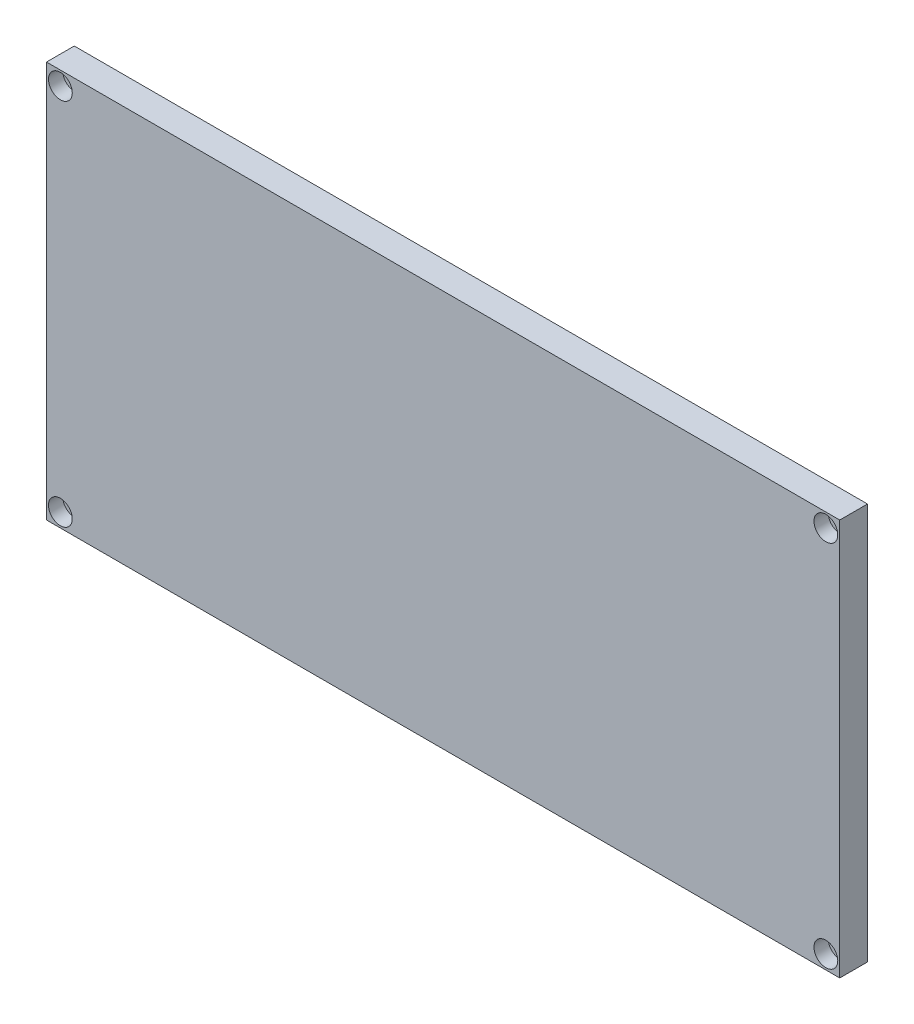
ISO-10303-21;
HEADER;
FILE_DESCRIPTION(('STEP AP214'),'2;1');
FILE_NAME('part.step','',(''),(''),'','','');
FILE_SCHEMA(('AUTOMOTIVE_DESIGN { 1 0 10303 214 1 1 1 1 }'));
ENDSEC;
DATA;
#1=APPLICATION_CONTEXT('core data for automotive mechanical design processes');
#2=APPLICATION_PROTOCOL_DEFINITION('international standard','automotive_design',2000,#1);
#3=PRODUCT_CONTEXT('',#1,'mechanical');
#4=PRODUCT('Part','Part','',(#3));
#5=PRODUCT_RELATED_PRODUCT_CATEGORY('part','',(#4));
#6=PRODUCT_DEFINITION_FORMATION('','',#4);
#7=PRODUCT_DEFINITION_CONTEXT('part definition',#1,'design');
#8=PRODUCT_DEFINITION('design','',#6,#7);
#9=PRODUCT_DEFINITION_SHAPE('','',#8);
#10=(LENGTH_UNIT() NAMED_UNIT(*) SI_UNIT(.MILLI.,.METRE.));
#11=(NAMED_UNIT(*) PLANE_ANGLE_UNIT() SI_UNIT($,.RADIAN.));
#12=(NAMED_UNIT(*) SI_UNIT($,.STERADIAN.) SOLID_ANGLE_UNIT());
#13=UNCERTAINTY_MEASURE_WITH_UNIT(LENGTH_MEASURE(1.E-05),#10,'distance_accuracy_value','');
#14=(GEOMETRIC_REPRESENTATION_CONTEXT(3) GLOBAL_UNCERTAINTY_ASSIGNED_CONTEXT((#13)) GLOBAL_UNIT_ASSIGNED_CONTEXT((#10,
#11,#12)) REPRESENTATION_CONTEXT('',''));
#15=CARTESIAN_POINT('',(0.,0.,0.));
#16=DIRECTION('',(0.,0.,1.));
#17=DIRECTION('',(1.,0.,0.));
#18=AXIS2_PLACEMENT_3D('',#15,#16,#17);
#19=CARTESIAN_POINT('',(-25.4,12.7,-1.778));
#20=DIRECTION('',(-1.,0.,0.));
#21=DIRECTION('',(0.,-1.,0.));
#22=AXIS2_PLACEMENT_3D('',#19,#20,#21);
#23=PLANE('',#22);
#24=DIRECTION('',(0.,-1.,0.));
#25=VECTOR('',#24,1.);
#26=CARTESIAN_POINT('',(-25.4,12.7,0.));
#27=LINE('',#26,#25);
#28=CARTESIAN_POINT('',(-25.4,12.7,0.));
#29=VERTEX_POINT('',#28);
#30=CARTESIAN_POINT('',(-25.4,-12.7,0.));
#31=VERTEX_POINT('',#30);
#32=EDGE_CURVE('E116',#29,#31,#27,.T.);
#33=ORIENTED_EDGE('',*,*,#32,.F.);
#34=DIRECTION('',(0.,0.,1.));
#35=VECTOR('',#34,1.);
#36=CARTESIAN_POINT('',(-25.4,12.7,-1.778));
#37=LINE('',#36,#35);
#38=CARTESIAN_POINT('',(-25.4,12.7,-1.778));
#39=VERTEX_POINT('',#38);
#40=EDGE_CURVE('E11',#39,#29,#37,.T.);
#41=ORIENTED_EDGE('',*,*,#40,.F.);
#42=DIRECTION('',(0.,-1.,0.));
#43=VECTOR('',#42,1.);
#44=CARTESIAN_POINT('',(-25.4,12.7,-1.778));
#45=LINE('',#44,#43);
#46=CARTESIAN_POINT('',(-25.4,-12.7,-1.778));
#47=VERTEX_POINT('',#46);
#48=EDGE_CURVE('E107',#39,#47,#45,.T.);
#49=ORIENTED_EDGE('',*,*,#48,.T.);
#50=DIRECTION('',(0.,0.,1.));
#51=VECTOR('',#50,1.);
#52=CARTESIAN_POINT('',(-25.4,-12.7,-1.778));
#53=LINE('',#52,#51);
#54=EDGE_CURVE('E48',#47,#31,#53,.T.);
#55=ORIENTED_EDGE('',*,*,#54,.T.);
#56=EDGE_LOOP('',(#33,#41,#49,#55));
#57=FACE_BOUND('',#56,.T.);
#58=ADVANCED_FACE('F45',(#57),#23,.T.);
#59=CARTESIAN_POINT('',(-25.4,12.7,-1.778));
#60=DIRECTION('',(0.,1.,0.));
#61=DIRECTION('',(0.,0.,1.));
#62=AXIS2_PLACEMENT_3D('',#59,#60,#61);
#63=PLANE('',#62);
#64=DIRECTION('',(-1.,0.,0.));
#65=VECTOR('',#64,1.);
#66=CARTESIAN_POINT('',(-25.4,12.7,0.));
#67=LINE('',#66,#65);
#68=CARTESIAN_POINT('',(25.4,12.7,0.));
#69=VERTEX_POINT('',#68);
#70=EDGE_CURVE('E110',#69,#29,#67,.T.);
#71=ORIENTED_EDGE('',*,*,#70,.F.);
#72=DIRECTION('',(0.,0.,1.));
#73=VECTOR('',#72,1.);
#74=CARTESIAN_POINT('',(25.4,12.7,-1.778));
#75=LINE('',#74,#73);
#76=CARTESIAN_POINT('',(25.4,12.7,-1.778));
#77=VERTEX_POINT('',#76);
#78=EDGE_CURVE('E55',#77,#69,#75,.T.);
#79=ORIENTED_EDGE('',*,*,#78,.F.);
#80=DIRECTION('',(-1.,0.,0.));
#81=VECTOR('',#80,1.);
#82=CARTESIAN_POINT('',(-25.4,12.7,-1.778));
#83=LINE('',#82,#81);
#84=EDGE_CURVE('E102',#77,#39,#83,.T.);
#85=ORIENTED_EDGE('',*,*,#84,.T.);
#86=ORIENTED_EDGE('',*,*,#40,.T.);
#87=EDGE_LOOP('',(#71,#79,#85,#86));
#88=FACE_BOUND('',#87,.T.);
#89=ADVANCED_FACE('F133',(#88),#63,.T.);
#90=CARTESIAN_POINT('',(25.4,12.7,-1.778));
#91=DIRECTION('',(1.,0.,0.));
#92=DIRECTION('',(0.,0.,-1.));
#93=AXIS2_PLACEMENT_3D('',#90,#91,#92);
#94=PLANE('',#93);
#95=DIRECTION('',(0.,1.,0.));
#96=VECTOR('',#95,1.);
#97=CARTESIAN_POINT('',(25.4,12.7,0.));
#98=LINE('',#97,#96);
#99=CARTESIAN_POINT('',(25.4,-12.7,0.));
#100=VERTEX_POINT('',#99);
#101=EDGE_CURVE('E96',#100,#69,#98,.T.);
#102=ORIENTED_EDGE('',*,*,#101,.F.);
#103=DIRECTION('',(0.,0.,1.));
#104=VECTOR('',#103,1.);
#105=CARTESIAN_POINT('',(25.4,-12.7,-1.778));
#106=LINE('',#105,#104);
#107=CARTESIAN_POINT('',(25.4,-12.7,-1.778));
#108=VERTEX_POINT('',#107);
#109=EDGE_CURVE('E91',#108,#100,#106,.T.);
#110=ORIENTED_EDGE('',*,*,#109,.F.);
#111=DIRECTION('',(0.,1.,0.));
#112=VECTOR('',#111,1.);
#113=CARTESIAN_POINT('',(25.4,12.7,-1.778));
#114=LINE('',#113,#112);
#115=EDGE_CURVE('E94',#108,#77,#114,.T.);
#116=ORIENTED_EDGE('',*,*,#115,.T.);
#117=ORIENTED_EDGE('',*,*,#78,.T.);
#118=EDGE_LOOP('',(#102,#110,#116,#117));
#119=FACE_BOUND('',#118,.T.);
#120=ADVANCED_FACE('F93',(#119),#94,.T.);
#121=CARTESIAN_POINT('',(-25.4,-12.7,-1.778));
#122=DIRECTION('',(0.,-1.,0.));
#123=DIRECTION('',(1.,0.,0.));
#124=AXIS2_PLACEMENT_3D('',#121,#122,#123);
#125=PLANE('',#124);
#126=DIRECTION('',(1.,0.,0.));
#127=VECTOR('',#126,1.);
#128=CARTESIAN_POINT('',(-25.4,-12.7,0.));
#129=LINE('',#128,#127);
#130=EDGE_CURVE('E120',#31,#100,#129,.T.);
#131=ORIENTED_EDGE('',*,*,#130,.F.);
#132=ORIENTED_EDGE('',*,*,#54,.F.);
#133=DIRECTION('',(1.,0.,0.));
#134=VECTOR('',#133,1.);
#135=CARTESIAN_POINT('',(-25.4,-12.7,-1.778));
#136=LINE('',#135,#134);
#137=EDGE_CURVE('E101',#47,#108,#136,.T.);
#138=ORIENTED_EDGE('',*,*,#137,.T.);
#139=ORIENTED_EDGE('',*,*,#109,.T.);
#140=EDGE_LOOP('',(#131,#132,#138,#139));
#141=FACE_BOUND('',#140,.T.);
#142=ADVANCED_FACE('F105',(#141),#125,.T.);
#143=CARTESIAN_POINT('',(0.,0.,-1.778));
#144=DIRECTION('',(0.,0.,1.));
#145=DIRECTION('',(1.,0.,0.));
#146=AXIS2_PLACEMENT_3D('',#143,#144,#145);
#147=PLANE('',#146);
#148=ORIENTED_EDGE('',*,*,#48,.F.);
#149=ORIENTED_EDGE('',*,*,#84,.F.);
#150=ORIENTED_EDGE('',*,*,#115,.F.);
#151=ORIENTED_EDGE('',*,*,#137,.F.);
#152=EDGE_LOOP('',(#148,#149,#150,#151));
#153=FACE_BOUND('',#152,.T.);
#154=ADVANCED_FACE('F100',(#153),#147,.F.);
#155=CARTESIAN_POINT('',(0.,0.,0.));
#156=DIRECTION('',(0.,0.,1.));
#157=DIRECTION('',(1.,0.,0.));
#158=AXIS2_PLACEMENT_3D('',#155,#156,#157);
#159=PLANE('',#158);
#160=CARTESIAN_POINT('',(-24.511,-11.811,0.));
#161=DIRECTION('',(0.,0.,1.));
#162=DIRECTION('',(-1.,0.,0.));
#163=AXIS2_PLACEMENT_3D('',#160,#161,#162);
#164=CIRCLE('',#163,0.761999999999999);
#165=CARTESIAN_POINT('',(-25.273,-11.811,0.));
#166=VERTEX_POINT('',#165);
#167=EDGE_CURVE('E209',#166,#166,#164,.T.);
#168=ORIENTED_EDGE('',*,*,#167,.F.);
#169=EDGE_LOOP('',(#168));
#170=FACE_BOUND('',#169,.T.);
#171=CARTESIAN_POINT('',(24.511,-11.811,0.));
#172=DIRECTION('',(0.,0.,1.));
#173=DIRECTION('',(1.,0.,0.));
#174=AXIS2_PLACEMENT_3D('',#171,#172,#173);
#175=CIRCLE('',#174,0.761999999999999);
#176=CARTESIAN_POINT('',(25.273,-11.811,0.));
#177=VERTEX_POINT('',#176);
#178=EDGE_CURVE('E199',#177,#177,#175,.T.);
#179=ORIENTED_EDGE('',*,*,#178,.F.);
#180=EDGE_LOOP('',(#179));
#181=FACE_BOUND('',#180,.T.);
#182=CARTESIAN_POINT('',(24.511,11.811,0.));
#183=DIRECTION('',(0.,0.,1.));
#184=DIRECTION('',(-1.,0.,0.));
#185=AXIS2_PLACEMENT_3D('',#182,#183,#184);
#186=CIRCLE('',#185,0.761999999999999);
#187=CARTESIAN_POINT('',(23.749,11.811,0.));
#188=VERTEX_POINT('',#187);
#189=EDGE_CURVE('E191',#188,#188,#186,.T.);
#190=ORIENTED_EDGE('',*,*,#189,.F.);
#191=EDGE_LOOP('',(#190));
#192=FACE_BOUND('',#191,.T.);
#193=CARTESIAN_POINT('',(-24.511,11.811,0.));
#194=DIRECTION('',(0.,0.,1.));
#195=DIRECTION('',(1.,0.,0.));
#196=AXIS2_PLACEMENT_3D('',#193,#194,#195);
#197=CIRCLE('',#196,0.761999999999999);
#198=CARTESIAN_POINT('',(-23.749,11.811,0.));
#199=VERTEX_POINT('',#198);
#200=EDGE_CURVE('E194',#199,#199,#197,.T.);
#201=ORIENTED_EDGE('',*,*,#200,.F.);
#202=EDGE_LOOP('',(#201));
#203=FACE_BOUND('',#202,.T.);
#204=ORIENTED_EDGE('',*,*,#32,.T.);
#205=ORIENTED_EDGE('',*,*,#130,.T.);
#206=ORIENTED_EDGE('',*,*,#101,.T.);
#207=ORIENTED_EDGE('',*,*,#70,.T.);
#208=EDGE_LOOP('',(#204,#205,#206,#207));
#209=FACE_BOUND('',#208,.T.);
#210=ADVANCED_FACE('F132',(#170,#181,#192,#203,#209),#159,.T.);
#211=CARTESIAN_POINT('',(-24.511,11.811,-0.9144));
#212=DIRECTION('',(0.,0.,1.));
#213=DIRECTION('',(1.,0.,0.));
#214=AXIS2_PLACEMENT_3D('',#211,#212,#213);
#215=CYLINDRICAL_SURFACE('',#214,0.761999999999999);
#216=CARTESIAN_POINT('',(-24.511,11.811,-0.9144));
#217=DIRECTION('',(0.,0.,1.));
#218=DIRECTION('',(1.,0.,0.));
#219=AXIS2_PLACEMENT_3D('',#216,#217,#218);
#220=CIRCLE('',#219,0.761999999999999);
#221=CARTESIAN_POINT('',(-23.749,11.811,-0.9144));
#222=VERTEX_POINT('',#221);
#223=EDGE_CURVE('E121',#222,#222,#220,.T.);
#224=ORIENTED_EDGE('',*,*,#223,.F.);
#225=EDGE_LOOP('',(#224));
#226=FACE_BOUND('',#225,.T.);
#227=ORIENTED_EDGE('',*,*,#200,.T.);
#228=EDGE_LOOP('',(#227));
#229=FACE_BOUND('',#228,.T.);
#230=ADVANCED_FACE('F150',(#226,#229),#215,.F.);
#231=CARTESIAN_POINT('',(-24.511,11.811,-0.9144));
#232=DIRECTION('',(0.,0.,1.));
#233=DIRECTION('',(1.,0.,0.));
#234=AXIS2_PLACEMENT_3D('',#231,#232,#233);
#235=PLANE('',#234);
#236=ORIENTED_EDGE('',*,*,#223,.T.);
#237=EDGE_LOOP('',(#236));
#238=FACE_BOUND('',#237,.T.);
#239=ADVANCED_FACE('F155',(#238),#235,.T.);
#240=CARTESIAN_POINT('',(24.511,11.811,-0.9144));
#241=DIRECTION('',(0.,0.,1.));
#242=DIRECTION('',(1.,0.,0.));
#243=AXIS2_PLACEMENT_3D('',#240,#241,#242);
#244=CYLINDRICAL_SURFACE('',#243,0.761999999999999);
#245=CARTESIAN_POINT('',(24.511,11.811,-0.9144));
#246=DIRECTION('',(0.,0.,1.));
#247=DIRECTION('',(-1.,0.,0.));
#248=AXIS2_PLACEMENT_3D('',#245,#246,#247);
#249=CIRCLE('',#248,0.761999999999999);
#250=CARTESIAN_POINT('',(23.749,11.811,-0.9144));
#251=VERTEX_POINT('',#250);
#252=EDGE_CURVE('E188',#251,#251,#249,.T.);
#253=ORIENTED_EDGE('',*,*,#252,.F.);
#254=EDGE_LOOP('',(#253));
#255=FACE_BOUND('',#254,.T.);
#256=ORIENTED_EDGE('',*,*,#189,.T.);
#257=EDGE_LOOP('',(#256));
#258=FACE_BOUND('',#257,.T.);
#259=ADVANCED_FACE('F159',(#255,#258),#244,.F.);
#260=CARTESIAN_POINT('',(24.511,11.811,-0.9144));
#261=DIRECTION('',(0.,0.,-1.));
#262=DIRECTION('',(-1.,0.,0.));
#263=AXIS2_PLACEMENT_3D('',#260,#261,#262);
#264=PLANE('',#263);
#265=ORIENTED_EDGE('',*,*,#252,.T.);
#266=EDGE_LOOP('',(#265));
#267=FACE_BOUND('',#266,.T.);
#268=ADVANCED_FACE('F176',(#267),#264,.F.);
#269=CARTESIAN_POINT('',(24.511,-11.811,-0.9144));
#270=DIRECTION('',(0.,0.,1.));
#271=DIRECTION('',(1.,0.,0.));
#272=AXIS2_PLACEMENT_3D('',#269,#270,#271);
#273=CYLINDRICAL_SURFACE('',#272,0.761999999999999);
#274=CARTESIAN_POINT('',(24.511,-11.811,-0.9144));
#275=DIRECTION('',(0.,0.,1.));
#276=DIRECTION('',(1.,0.,0.));
#277=AXIS2_PLACEMENT_3D('',#274,#275,#276);
#278=CIRCLE('',#277,0.761999999999999);
#279=CARTESIAN_POINT('',(25.273,-11.811,-0.9144));
#280=VERTEX_POINT('',#279);
#281=EDGE_CURVE('E205',#280,#280,#278,.T.);
#282=ORIENTED_EDGE('',*,*,#281,.F.);
#283=EDGE_LOOP('',(#282));
#284=FACE_BOUND('',#283,.T.);
#285=ORIENTED_EDGE('',*,*,#178,.T.);
#286=EDGE_LOOP('',(#285));
#287=FACE_BOUND('',#286,.T.);
#288=ADVANCED_FACE('F172',(#284,#287),#273,.F.);
#289=CARTESIAN_POINT('',(24.511,-11.811,-0.9144));
#290=DIRECTION('',(0.,0.,1.));
#291=DIRECTION('',(1.,0.,0.));
#292=AXIS2_PLACEMENT_3D('',#289,#290,#291);
#293=PLANE('',#292);
#294=ORIENTED_EDGE('',*,*,#281,.T.);
#295=EDGE_LOOP('',(#294));
#296=FACE_BOUND('',#295,.T.);
#297=ADVANCED_FACE('F168',(#296),#293,.T.);
#298=CARTESIAN_POINT('',(-24.511,-11.811,-0.9144));
#299=DIRECTION('',(0.,0.,1.));
#300=DIRECTION('',(1.,0.,0.));
#301=AXIS2_PLACEMENT_3D('',#298,#299,#300);
#302=CYLINDRICAL_SURFACE('',#301,0.761999999999999);
#303=CARTESIAN_POINT('',(-24.511,-11.811,-0.9144));
#304=DIRECTION('',(0.,0.,1.));
#305=DIRECTION('',(-1.,0.,0.));
#306=AXIS2_PLACEMENT_3D('',#303,#304,#305);
#307=CIRCLE('',#306,0.761999999999999);
#308=CARTESIAN_POINT('',(-25.273,-11.811,-0.9144));
#309=VERTEX_POINT('',#308);
#310=EDGE_CURVE('E213',#309,#309,#307,.T.);
#311=ORIENTED_EDGE('',*,*,#310,.F.);
#312=EDGE_LOOP('',(#311));
#313=FACE_BOUND('',#312,.T.);
#314=ORIENTED_EDGE('',*,*,#167,.T.);
#315=EDGE_LOOP('',(#314));
#316=FACE_BOUND('',#315,.T.);
#317=ADVANCED_FACE('F164',(#313,#316),#302,.F.);
#318=CARTESIAN_POINT('',(-24.511,-11.811,-0.9144));
#319=DIRECTION('',(0.,0.,-1.));
#320=DIRECTION('',(-1.,0.,0.));
#321=AXIS2_PLACEMENT_3D('',#318,#319,#320);
#322=PLANE('',#321);
#323=ORIENTED_EDGE('',*,*,#310,.T.);
#324=EDGE_LOOP('',(#323));
#325=FACE_BOUND('',#324,.T.);
#326=ADVANCED_FACE('F161',(#325),#322,.F.);
#327=CLOSED_SHELL('',(#58,#89,#120,#142,#154,#210,#230,#239,#259,#268,#288,#297,#317,#326));
#328=MANIFOLD_SOLID_BREP('B2',#327);
#329=ADVANCED_BREP_SHAPE_REPRESENTATION('',(#18,#328),#14);
#330=SHAPE_DEFINITION_REPRESENTATION(#9,#329);
ENDSEC;
END-ISO-10303-21;
